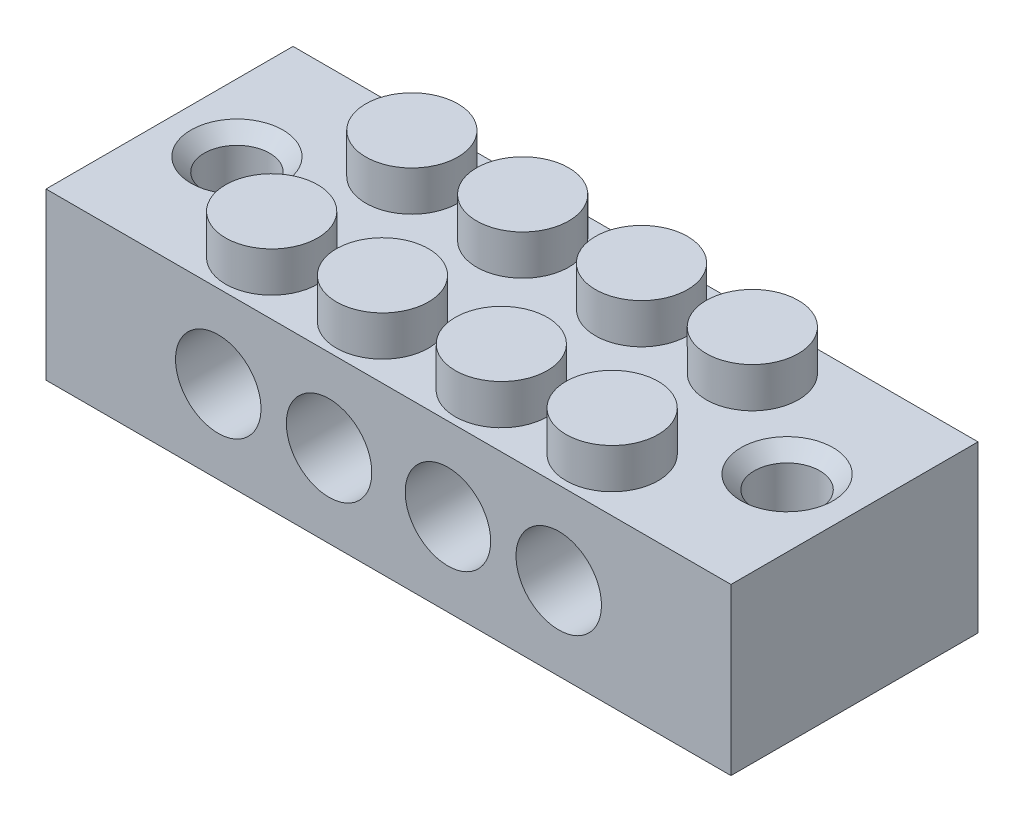
ISO-10303-21;
HEADER;
FILE_DESCRIPTION(('STEP AP214'),'2;1');
FILE_NAME('part.step','',(''),(''),'','','');
FILE_SCHEMA(('AUTOMOTIVE_DESIGN { 1 0 10303 214 1 1 1 1 }'));
ENDSEC;
DATA;
#1=APPLICATION_CONTEXT('core data for automotive mechanical design processes');
#2=APPLICATION_PROTOCOL_DEFINITION('international standard','automotive_design',2000,#1);
#3=PRODUCT_CONTEXT('',#1,'mechanical');
#4=PRODUCT('Part','Part','',(#3));
#5=PRODUCT_RELATED_PRODUCT_CATEGORY('part','',(#4));
#6=PRODUCT_DEFINITION_FORMATION('','',#4);
#7=PRODUCT_DEFINITION_CONTEXT('part definition',#1,'design');
#8=PRODUCT_DEFINITION('design','',#6,#7);
#9=PRODUCT_DEFINITION_SHAPE('','',#8);
#10=(LENGTH_UNIT() NAMED_UNIT(*) SI_UNIT(.MILLI.,.METRE.));
#11=(NAMED_UNIT(*) PLANE_ANGLE_UNIT() SI_UNIT($,.RADIAN.));
#12=(NAMED_UNIT(*) SI_UNIT($,.STERADIAN.) SOLID_ANGLE_UNIT());
#13=UNCERTAINTY_MEASURE_WITH_UNIT(LENGTH_MEASURE(1.E-05),#10,'distance_accuracy_value','');
#14=(GEOMETRIC_REPRESENTATION_CONTEXT(3) GLOBAL_UNCERTAINTY_ASSIGNED_CONTEXT((#13)) GLOBAL_UNIT_ASSIGNED_CONTEXT((#10,
#11,#12)) REPRESENTATION_CONTEXT('',''));
#15=CARTESIAN_POINT('',(0.,0.,0.));
#16=DIRECTION('',(0.,0.,1.));
#17=DIRECTION('',(1.,0.,0.));
#18=AXIS2_PLACEMENT_3D('',#15,#16,#17);
#19=CARTESIAN_POINT('',(-25.65,12.4,9.25000000000001));
#20=DIRECTION('',(1.,0.,0.));
#21=DIRECTION('',(0.,0.,-1.));
#22=AXIS2_PLACEMENT_3D('',#19,#20,#21);
#23=PLANE('',#22);
#24=DIRECTION('',(0.,0.,1.));
#25=VECTOR('',#24,1.);
#26=CARTESIAN_POINT('',(-25.65,0.,9.25000000000001));
#27=LINE('',#26,#25);
#28=CARTESIAN_POINT('',(-25.65,0.,-9.24999999999999));
#29=VERTEX_POINT('',#28);
#30=CARTESIAN_POINT('',(-25.65,0.,9.25000000000001));
#31=VERTEX_POINT('',#30);
#32=EDGE_CURVE('E101',#29,#31,#27,.T.);
#33=ORIENTED_EDGE('',*,*,#32,.T.);
#34=DIRECTION('',(0.,-1.,0.));
#35=VECTOR('',#34,1.);
#36=CARTESIAN_POINT('',(-25.65,12.4,9.25000000000001));
#37=LINE('',#36,#35);
#38=CARTESIAN_POINT('',(-25.65,12.4,9.25000000000001));
#39=VERTEX_POINT('',#38);
#40=EDGE_CURVE('E92',#39,#31,#37,.T.);
#41=ORIENTED_EDGE('',*,*,#40,.F.);
#42=DIRECTION('',(0.,0.,1.));
#43=VECTOR('',#42,1.);
#44=CARTESIAN_POINT('',(-25.65,12.4,9.25000000000001));
#45=LINE('',#44,#43);
#46=CARTESIAN_POINT('',(-25.65,12.4,-9.24999999999999));
#47=VERTEX_POINT('',#46);
#48=EDGE_CURVE('E86',#47,#39,#45,.T.);
#49=ORIENTED_EDGE('',*,*,#48,.F.);
#50=DIRECTION('',(0.,-1.,0.));
#51=VECTOR('',#50,1.);
#52=CARTESIAN_POINT('',(-25.65,12.4,-9.24999999999999));
#53=LINE('',#52,#51);
#54=EDGE_CURVE('E97',#47,#29,#53,.T.);
#55=ORIENTED_EDGE('',*,*,#54,.T.);
#56=EDGE_LOOP('',(#33,#41,#49,#55));
#57=FACE_BOUND('',#56,.T.);
#58=ADVANCED_FACE('F33',(#57),#23,.F.);
#59=CARTESIAN_POINT('',(25.65,12.4,9.25));
#60=DIRECTION('',(0.,0.,-1.));
#61=DIRECTION('',(-1.,0.,0.));
#62=AXIS2_PLACEMENT_3D('',#59,#60,#61);
#63=PLANE('',#62);
#64=CARTESIAN_POINT('',(-4.45,6.2,9.25));
#65=DIRECTION('',(0.,0.,-1.));
#66=DIRECTION('',(-1.,0.,0.));
#67=AXIS2_PLACEMENT_3D('',#64,#65,#66);
#68=CIRCLE('',#67,3.2);
#69=CARTESIAN_POINT('',(-7.65,6.2,9.25));
#70=VERTEX_POINT('',#69);
#71=EDGE_CURVE('E314',#70,#70,#68,.T.);
#72=ORIENTED_EDGE('',*,*,#71,.T.);
#73=EDGE_LOOP('',(#72));
#74=FACE_BOUND('',#73,.T.);
#75=CARTESIAN_POINT('',(-12.75,6.2,9.25));
#76=DIRECTION('',(0.,0.,-1.));
#77=DIRECTION('',(-1.,0.,0.));
#78=AXIS2_PLACEMENT_3D('',#75,#76,#77);
#79=CIRCLE('',#78,3.2);
#80=CARTESIAN_POINT('',(-15.95,6.2,9.25));
#81=VERTEX_POINT('',#80);
#82=EDGE_CURVE('E309',#81,#81,#79,.T.);
#83=ORIENTED_EDGE('',*,*,#82,.T.);
#84=EDGE_LOOP('',(#83));
#85=FACE_BOUND('',#84,.T.);
#86=CARTESIAN_POINT('',(4.45,6.2,9.25));
#87=DIRECTION('',(0.,0.,1.));
#88=DIRECTION('',(1.,0.,0.));
#89=AXIS2_PLACEMENT_3D('',#86,#87,#88);
#90=CIRCLE('',#89,3.2);
#91=CARTESIAN_POINT('',(7.65,6.2,9.25));
#92=VERTEX_POINT('',#91);
#93=EDGE_CURVE('E327',#92,#92,#90,.T.);
#94=ORIENTED_EDGE('',*,*,#93,.F.);
#95=EDGE_LOOP('',(#94));
#96=FACE_BOUND('',#95,.T.);
#97=CARTESIAN_POINT('',(12.75,6.2,9.25));
#98=DIRECTION('',(0.,0.,1.));
#99=DIRECTION('',(1.,0.,0.));
#100=AXIS2_PLACEMENT_3D('',#97,#98,#99);
#101=CIRCLE('',#100,3.2);
#102=CARTESIAN_POINT('',(15.95,6.2,9.25));
#103=VERTEX_POINT('',#102);
#104=EDGE_CURVE('E324',#103,#103,#101,.T.);
#105=ORIENTED_EDGE('',*,*,#104,.F.);
#106=EDGE_LOOP('',(#105));
#107=FACE_BOUND('',#106,.T.);
#108=DIRECTION('',(1.,0.,0.));
#109=VECTOR('',#108,1.);
#110=CARTESIAN_POINT('',(25.65,0.,9.25));
#111=LINE('',#110,#109);
#112=CARTESIAN_POINT('',(25.65,0.,9.25));
#113=VERTEX_POINT('',#112);
#114=EDGE_CURVE('E91',#31,#113,#111,.T.);
#115=ORIENTED_EDGE('',*,*,#114,.T.);
#116=DIRECTION('',(0.,-1.,0.));
#117=VECTOR('',#116,1.);
#118=CARTESIAN_POINT('',(25.65,12.4,9.25));
#119=LINE('',#118,#117);
#120=CARTESIAN_POINT('',(25.65,12.4,9.25));
#121=VERTEX_POINT('',#120);
#122=EDGE_CURVE('E89',#121,#113,#119,.T.);
#123=ORIENTED_EDGE('',*,*,#122,.F.);
#124=DIRECTION('',(1.,0.,0.));
#125=VECTOR('',#124,1.);
#126=CARTESIAN_POINT('',(25.65,12.4,9.25));
#127=LINE('',#126,#125);
#128=EDGE_CURVE('E81',#39,#121,#127,.T.);
#129=ORIENTED_EDGE('',*,*,#128,.F.);
#130=ORIENTED_EDGE('',*,*,#40,.T.);
#131=EDGE_LOOP('',(#115,#123,#129,#130));
#132=FACE_BOUND('',#131,.T.);
#133=ADVANCED_FACE('F90',(#74,#85,#96,#107,#132),#63,.F.);
#134=CARTESIAN_POINT('',(25.65,12.4,9.25));
#135=DIRECTION('',(-1.,0.,0.));
#136=DIRECTION('',(0.,0.,1.));
#137=AXIS2_PLACEMENT_3D('',#134,#135,#136);
#138=PLANE('',#137);
#139=DIRECTION('',(0.,0.,-1.));
#140=VECTOR('',#139,1.);
#141=CARTESIAN_POINT('',(25.65,0.,9.25));
#142=LINE('',#141,#140);
#143=CARTESIAN_POINT('',(25.65,0.,-9.25));
#144=VERTEX_POINT('',#143);
#145=EDGE_CURVE('E67',#113,#144,#142,.T.);
#146=ORIENTED_EDGE('',*,*,#145,.T.);
#147=DIRECTION('',(0.,-1.,0.));
#148=VECTOR('',#147,1.);
#149=CARTESIAN_POINT('',(25.65,12.4,-9.25));
#150=LINE('',#149,#148);
#151=CARTESIAN_POINT('',(25.65,12.4,-9.25));
#152=VERTEX_POINT('',#151);
#153=EDGE_CURVE('E93',#152,#144,#150,.T.);
#154=ORIENTED_EDGE('',*,*,#153,.F.);
#155=DIRECTION('',(0.,0.,-1.));
#156=VECTOR('',#155,1.);
#157=CARTESIAN_POINT('',(25.65,12.4,9.25));
#158=LINE('',#157,#156);
#159=EDGE_CURVE('E84',#121,#152,#158,.T.);
#160=ORIENTED_EDGE('',*,*,#159,.F.);
#161=ORIENTED_EDGE('',*,*,#122,.T.);
#162=EDGE_LOOP('',(#146,#154,#160,#161));
#163=FACE_BOUND('',#162,.T.);
#164=ADVANCED_FACE('F95',(#163),#138,.F.);
#165=CARTESIAN_POINT('',(25.65,12.4,-9.25));
#166=DIRECTION('',(0.,0.,1.));
#167=DIRECTION('',(1.,0.,0.));
#168=AXIS2_PLACEMENT_3D('',#165,#166,#167);
#169=PLANE('',#168);
#170=CARTESIAN_POINT('',(-4.45,6.2,-9.25));
#171=DIRECTION('',(0.,0.,-1.));
#172=DIRECTION('',(-1.,0.,0.));
#173=AXIS2_PLACEMENT_3D('',#170,#171,#172);
#174=CIRCLE('',#173,3.2);
#175=CARTESIAN_POINT('',(-7.65,6.2,-9.25));
#176=VERTEX_POINT('',#175);
#177=EDGE_CURVE('E310',#176,#176,#174,.T.);
#178=ORIENTED_EDGE('',*,*,#177,.F.);
#179=EDGE_LOOP('',(#178));
#180=FACE_BOUND('',#179,.T.);
#181=CARTESIAN_POINT('',(-12.75,6.2,-9.25));
#182=DIRECTION('',(0.,0.,-1.));
#183=DIRECTION('',(-1.,0.,0.));
#184=AXIS2_PLACEMENT_3D('',#181,#182,#183);
#185=CIRCLE('',#184,3.2);
#186=CARTESIAN_POINT('',(-15.95,6.2,-9.25));
#187=VERTEX_POINT('',#186);
#188=EDGE_CURVE('E317',#187,#187,#185,.T.);
#189=ORIENTED_EDGE('',*,*,#188,.F.);
#190=EDGE_LOOP('',(#189));
#191=FACE_BOUND('',#190,.T.);
#192=CARTESIAN_POINT('',(4.45,6.2,-9.25));
#193=DIRECTION('',(0.,0.,1.));
#194=DIRECTION('',(1.,0.,0.));
#195=AXIS2_PLACEMENT_3D('',#192,#193,#194);
#196=CIRCLE('',#195,3.2);
#197=CARTESIAN_POINT('',(7.65,6.2,-9.25));
#198=VERTEX_POINT('',#197);
#199=EDGE_CURVE('E104',#198,#198,#196,.T.);
#200=ORIENTED_EDGE('',*,*,#199,.T.);
#201=EDGE_LOOP('',(#200));
#202=FACE_BOUND('',#201,.T.);
#203=CARTESIAN_POINT('',(12.75,6.2,-9.25));
#204=DIRECTION('',(0.,0.,1.));
#205=DIRECTION('',(1.,0.,0.));
#206=AXIS2_PLACEMENT_3D('',#203,#204,#205);
#207=CIRCLE('',#206,3.2);
#208=CARTESIAN_POINT('',(15.95,6.2,-9.25));
#209=VERTEX_POINT('',#208);
#210=EDGE_CURVE('E330',#209,#209,#207,.T.);
#211=ORIENTED_EDGE('',*,*,#210,.T.);
#212=EDGE_LOOP('',(#211));
#213=FACE_BOUND('',#212,.T.);
#214=DIRECTION('',(-1.,0.,0.));
#215=VECTOR('',#214,1.);
#216=CARTESIAN_POINT('',(25.65,0.,-9.25));
#217=LINE('',#216,#215);
#218=EDGE_CURVE('E73',#144,#29,#217,.T.);
#219=ORIENTED_EDGE('',*,*,#218,.T.);
#220=ORIENTED_EDGE('',*,*,#54,.F.);
#221=DIRECTION('',(-1.,0.,0.));
#222=VECTOR('',#221,1.);
#223=CARTESIAN_POINT('',(25.65,12.4,-9.25));
#224=LINE('',#223,#222);
#225=EDGE_CURVE('E50',#152,#47,#224,.T.);
#226=ORIENTED_EDGE('',*,*,#225,.F.);
#227=ORIENTED_EDGE('',*,*,#153,.T.);
#228=EDGE_LOOP('',(#219,#220,#226,#227));
#229=FACE_BOUND('',#228,.T.);
#230=ADVANCED_FACE('F136',(#180,#191,#202,#213,#229),#169,.F.);
#231=CARTESIAN_POINT('',(0.,12.4,0.));
#232=DIRECTION('',(0.,1.,0.));
#233=DIRECTION('',(0.,0.,1.));
#234=AXIS2_PLACEMENT_3D('',#231,#232,#233);
#235=PLANE('',#234);
#236=CARTESIAN_POINT('',(-12.75,12.4,5.25));
#237=DIRECTION('',(0.,1.,0.));
#238=DIRECTION('',(0.,0.,1.));
#239=AXIS2_PLACEMENT_3D('',#236,#237,#238);
#240=CIRCLE('',#239,3.45);
#241=CARTESIAN_POINT('',(-12.75,12.4,8.7));
#242=VERTEX_POINT('',#241);
#243=EDGE_CURVE('E11',#242,#242,#240,.T.);
#244=ORIENTED_EDGE('',*,*,#243,.F.);
#245=EDGE_LOOP('',(#244));
#246=FACE_BOUND('',#245,.T.);
#247=CARTESIAN_POINT('',(-4.45,12.4,5.25));
#248=DIRECTION('',(0.,1.,0.));
#249=DIRECTION('',(0.,0.,1.));
#250=AXIS2_PLACEMENT_3D('',#247,#248,#249);
#251=CIRCLE('',#250,3.45);
#252=CARTESIAN_POINT('',(-4.45,12.4,8.7));
#253=VERTEX_POINT('',#252);
#254=EDGE_CURVE('E42',#253,#253,#251,.T.);
#255=ORIENTED_EDGE('',*,*,#254,.F.);
#256=EDGE_LOOP('',(#255));
#257=FACE_BOUND('',#256,.T.);
#258=CARTESIAN_POINT('',(-12.75,12.4,-5.25));
#259=DIRECTION('',(0.,1.,0.));
#260=DIRECTION('',(0.,0.,-1.));
#261=AXIS2_PLACEMENT_3D('',#258,#259,#260);
#262=CIRCLE('',#261,3.45);
#263=CARTESIAN_POINT('',(-12.75,12.4,-8.7));
#264=VERTEX_POINT('',#263);
#265=EDGE_CURVE('E142',#264,#264,#262,.T.);
#266=ORIENTED_EDGE('',*,*,#265,.F.);
#267=EDGE_LOOP('',(#266));
#268=FACE_BOUND('',#267,.T.);
#269=CARTESIAN_POINT('',(-4.45,12.4,-5.25));
#270=DIRECTION('',(0.,1.,0.));
#271=DIRECTION('',(0.,0.,-1.));
#272=AXIS2_PLACEMENT_3D('',#269,#270,#271);
#273=CIRCLE('',#272,3.45);
#274=CARTESIAN_POINT('',(-4.45,12.4,-8.7));
#275=VERTEX_POINT('',#274);
#276=EDGE_CURVE('E146',#275,#275,#273,.T.);
#277=ORIENTED_EDGE('',*,*,#276,.F.);
#278=EDGE_LOOP('',(#277));
#279=FACE_BOUND('',#278,.T.);
#280=CARTESIAN_POINT('',(12.75,12.4,-5.25));
#281=DIRECTION('',(0.,1.,0.));
#282=DIRECTION('',(0.,0.,1.));
#283=AXIS2_PLACEMENT_3D('',#280,#281,#282);
#284=CIRCLE('',#283,3.45);
#285=CARTESIAN_POINT('',(12.75,12.4,-1.8));
#286=VERTEX_POINT('',#285);
#287=EDGE_CURVE('E126',#286,#286,#284,.T.);
#288=ORIENTED_EDGE('',*,*,#287,.F.);
#289=EDGE_LOOP('',(#288));
#290=FACE_BOUND('',#289,.T.);
#291=CARTESIAN_POINT('',(4.45,12.4,-5.25));
#292=DIRECTION('',(0.,1.,0.));
#293=DIRECTION('',(0.,0.,1.));
#294=AXIS2_PLACEMENT_3D('',#291,#292,#293);
#295=CIRCLE('',#294,3.45);
#296=CARTESIAN_POINT('',(4.45,12.4,-1.8));
#297=VERTEX_POINT('',#296);
#298=EDGE_CURVE('E123',#297,#297,#295,.T.);
#299=ORIENTED_EDGE('',*,*,#298,.F.);
#300=EDGE_LOOP('',(#299));
#301=FACE_BOUND('',#300,.T.);
#302=CARTESIAN_POINT('',(12.75,12.4,5.25));
#303=DIRECTION('',(0.,1.,0.));
#304=DIRECTION('',(0.,0.,1.));
#305=AXIS2_PLACEMENT_3D('',#302,#303,#304);
#306=CIRCLE('',#305,3.45);
#307=CARTESIAN_POINT('',(12.75,12.4,8.7));
#308=VERTEX_POINT('',#307);
#309=EDGE_CURVE('E154',#308,#308,#306,.T.);
#310=ORIENTED_EDGE('',*,*,#309,.F.);
#311=EDGE_LOOP('',(#310));
#312=FACE_BOUND('',#311,.T.);
#313=CARTESIAN_POINT('',(4.45,12.4,5.25));
#314=DIRECTION('',(0.,1.,0.));
#315=DIRECTION('',(0.,0.,1.));
#316=AXIS2_PLACEMENT_3D('',#313,#314,#315);
#317=CIRCLE('',#316,3.45);
#318=CARTESIAN_POINT('',(4.45,12.4,8.7));
#319=VERTEX_POINT('',#318);
#320=EDGE_CURVE('E158',#319,#319,#317,.T.);
#321=ORIENTED_EDGE('',*,*,#320,.F.);
#322=EDGE_LOOP('',(#321));
#323=FACE_BOUND('',#322,.T.);
#324=CARTESIAN_POINT('',(20.6,12.4,0.));
#325=DIRECTION('',(0.,1.,0.));
#326=DIRECTION('',(0.,0.,1.));
#327=AXIS2_PLACEMENT_3D('',#324,#325,#326);
#328=CIRCLE('',#327,3.45000000000004);
#329=CARTESIAN_POINT('',(20.6,12.4,3.45000000000004));
#330=VERTEX_POINT('',#329);
#331=EDGE_CURVE('E117',#330,#330,#328,.F.);
#332=ORIENTED_EDGE('',*,*,#331,.T.);
#333=EDGE_LOOP('',(#332));
#334=FACE_BOUND('',#333,.T.);
#335=CARTESIAN_POINT('',(-20.6,12.4,0.));
#336=DIRECTION('',(0.,1.,0.));
#337=DIRECTION('',(0.,0.,1.));
#338=AXIS2_PLACEMENT_3D('',#335,#336,#337);
#339=CIRCLE('',#338,3.44999999999998);
#340=CARTESIAN_POINT('',(-20.6,12.4,3.44999999999998));
#341=VERTEX_POINT('',#340);
#342=EDGE_CURVE('E114',#341,#341,#339,.F.);
#343=ORIENTED_EDGE('',*,*,#342,.T.);
#344=EDGE_LOOP('',(#343));
#345=FACE_BOUND('',#344,.T.);
#346=ORIENTED_EDGE('',*,*,#48,.T.);
#347=ORIENTED_EDGE('',*,*,#128,.T.);
#348=ORIENTED_EDGE('',*,*,#159,.T.);
#349=ORIENTED_EDGE('',*,*,#225,.T.);
#350=EDGE_LOOP('',(#346,#347,#348,#349));
#351=FACE_BOUND('',#350,.T.);
#352=ADVANCED_FACE('F82',(#246,#257,#268,#279,#290,#301,#312,#323,#334,#345,#351),#235,.T.);
#353=CARTESIAN_POINT('',(0.,0.,0.));
#354=DIRECTION('',(0.,1.,0.));
#355=DIRECTION('',(0.,0.,1.));
#356=AXIS2_PLACEMENT_3D('',#353,#354,#355);
#357=PLANE('',#356);
#358=CARTESIAN_POINT('',(-20.6,0.,0.));
#359=DIRECTION('',(0.,-1.,0.));
#360=DIRECTION('',(0.,0.,1.));
#361=AXIS2_PLACEMENT_3D('',#358,#359,#360);
#362=CIRCLE('',#361,2.45);
#363=CARTESIAN_POINT('',(-20.6,0.,2.45));
#364=VERTEX_POINT('',#363);
#365=EDGE_CURVE('E305',#364,#364,#362,.T.);
#366=ORIENTED_EDGE('',*,*,#365,.F.);
#367=EDGE_LOOP('',(#366));
#368=FACE_BOUND('',#367,.T.);
#369=CARTESIAN_POINT('',(20.6,0.,0.));
#370=DIRECTION('',(0.,1.,0.));
#371=DIRECTION('',(0.,0.,1.));
#372=AXIS2_PLACEMENT_3D('',#369,#370,#371);
#373=CIRCLE('',#372,2.45);
#374=CARTESIAN_POINT('',(20.6,0.,2.45));
#375=VERTEX_POINT('',#374);
#376=EDGE_CURVE('E313',#375,#375,#373,.T.);
#377=ORIENTED_EDGE('',*,*,#376,.T.);
#378=EDGE_LOOP('',(#377));
#379=FACE_BOUND('',#378,.T.);
#380=ORIENTED_EDGE('',*,*,#32,.F.);
#381=ORIENTED_EDGE('',*,*,#218,.F.);
#382=ORIENTED_EDGE('',*,*,#145,.F.);
#383=ORIENTED_EDGE('',*,*,#114,.F.);
#384=EDGE_LOOP('',(#380,#381,#382,#383));
#385=FACE_BOUND('',#384,.T.);
#386=ADVANCED_FACE('F135',(#368,#379,#385),#357,.F.);
#387=CARTESIAN_POINT('',(12.75,6.2,-9.25));
#388=DIRECTION('',(0.,0.,1.));
#389=DIRECTION('',(1.,0.,0.));
#390=AXIS2_PLACEMENT_3D('',#387,#388,#389);
#391=CYLINDRICAL_SURFACE('',#390,3.2);
#392=ORIENTED_EDGE('',*,*,#210,.F.);
#393=EDGE_LOOP('',(#392));
#394=FACE_BOUND('',#393,.T.);
#395=ORIENTED_EDGE('',*,*,#104,.T.);
#396=EDGE_LOOP('',(#395));
#397=FACE_BOUND('',#396,.T.);
#398=ADVANCED_FACE('F192',(#394,#397),#391,.F.);
#399=CARTESIAN_POINT('',(4.45,6.2,-9.25));
#400=DIRECTION('',(0.,0.,1.));
#401=DIRECTION('',(1.,0.,0.));
#402=AXIS2_PLACEMENT_3D('',#399,#400,#401);
#403=CYLINDRICAL_SURFACE('',#402,3.2);
#404=ORIENTED_EDGE('',*,*,#199,.F.);
#405=EDGE_LOOP('',(#404));
#406=FACE_BOUND('',#405,.T.);
#407=ORIENTED_EDGE('',*,*,#93,.T.);
#408=EDGE_LOOP('',(#407));
#409=FACE_BOUND('',#408,.T.);
#410=ADVANCED_FACE('F197',(#406,#409),#403,.F.);
#411=CARTESIAN_POINT('',(20.6,0.,0.));
#412=DIRECTION('',(0.,1.,0.));
#413=DIRECTION('',(0.,0.,1.));
#414=AXIS2_PLACEMENT_3D('',#411,#412,#413);
#415=CYLINDRICAL_SURFACE('',#414,2.45);
#416=CARTESIAN_POINT('',(20.6,11.4,0.));
#417=DIRECTION('',(0.,1.,0.));
#418=DIRECTION('',(0.,0.,1.));
#419=AXIS2_PLACEMENT_3D('',#416,#417,#418);
#420=CIRCLE('',#419,2.45);
#421=CARTESIAN_POINT('',(20.6,11.4,2.45));
#422=VERTEX_POINT('',#421);
#423=EDGE_CURVE('E111',#422,#422,#420,.T.);
#424=CARTESIAN_POINT('',(20.6,11.4,2.45));
#425=CARTESIAN_POINT('',(20.6,11.28125,2.45));
#426=CARTESIAN_POINT('',(20.6,11.1625,2.45));
#427=CARTESIAN_POINT('',(20.6,10.925,2.45));
#428=CARTESIAN_POINT('',(20.6,10.80625,2.45));
#429=CARTESIAN_POINT('',(20.6,10.56875,2.45));
#430=CARTESIAN_POINT('',(20.6,10.45,2.45));
#431=CARTESIAN_POINT('',(20.6,10.2125,2.45));
#432=CARTESIAN_POINT('',(20.6,10.09375,2.45));
#433=CARTESIAN_POINT('',(20.6,9.85624999999997,2.45));
#434=CARTESIAN_POINT('',(20.6,9.73749999999998,2.45));
#435=CARTESIAN_POINT('',(20.6,9.49999999999998,2.45));
#436=CARTESIAN_POINT('',(20.6,9.38124999999997,2.45));
#437=CARTESIAN_POINT('',(20.6,9.14374999999998,2.45));
#438=CARTESIAN_POINT('',(20.6,9.02499999999998,2.45));
#439=CARTESIAN_POINT('',(20.6,8.78749999999998,2.45));
#440=CARTESIAN_POINT('',(20.6,8.66874999999998,2.45));
#441=CARTESIAN_POINT('',(20.6,8.43124999999998,2.45));
#442=CARTESIAN_POINT('',(20.6,8.31249999999998,2.45));
#443=CARTESIAN_POINT('',(20.6,8.07499999999998,2.45));
#444=CARTESIAN_POINT('',(20.6,7.95624999999998,2.45));
#445=CARTESIAN_POINT('',(20.6,7.71874999999998,2.45));
#446=CARTESIAN_POINT('',(20.6,7.59999999999998,2.45));
#447=CARTESIAN_POINT('',(20.6,7.36249999999998,2.45));
#448=CARTESIAN_POINT('',(20.6,7.24374999999998,2.45));
#449=CARTESIAN_POINT('',(20.6,7.00624999999998,2.45));
#450=CARTESIAN_POINT('',(20.6,6.88749999999998,2.45));
#451=CARTESIAN_POINT('',(20.6,6.64999999999998,2.45));
#452=CARTESIAN_POINT('',(20.6,6.53124999999998,2.45));
#453=CARTESIAN_POINT('',(20.6,6.29374999999998,2.45));
#454=CARTESIAN_POINT('',(20.6,6.17499999999998,2.45));
#455=CARTESIAN_POINT('',(20.6,5.93749999999998,2.45));
#456=CARTESIAN_POINT('',(20.6,5.81874999999999,2.45));
#457=CARTESIAN_POINT('',(20.6,5.58124999999999,2.45));
#458=CARTESIAN_POINT('',(20.6,5.46249999999999,2.45));
#459=CARTESIAN_POINT('',(20.6,5.22499999999999,2.45));
#460=CARTESIAN_POINT('',(20.6,5.10624999999999,2.45));
#461=CARTESIAN_POINT('',(20.6,4.86874999999999,2.45));
#462=CARTESIAN_POINT('',(20.6,4.74999999999999,2.45));
#463=CARTESIAN_POINT('',(20.6,4.51249999999999,2.45));
#464=CARTESIAN_POINT('',(20.6,4.39374999999999,2.45));
#465=CARTESIAN_POINT('',(20.6,4.15624999999999,2.45));
#466=CARTESIAN_POINT('',(20.6,4.03749999999999,2.45));
#467=CARTESIAN_POINT('',(20.6,3.79999999999999,2.45));
#468=CARTESIAN_POINT('',(20.6,3.68124999999999,2.45));
#469=CARTESIAN_POINT('',(20.6,3.44374999999999,2.45));
#470=CARTESIAN_POINT('',(20.6,3.32499999999999,2.45));
#471=CARTESIAN_POINT('',(20.6,3.08749999999999,2.45));
#472=CARTESIAN_POINT('',(20.6,2.96874999999999,2.45));
#473=CARTESIAN_POINT('',(20.6,2.73124999999999,2.45));
#474=CARTESIAN_POINT('',(20.6,2.61249999999999,2.45));
#475=CARTESIAN_POINT('',(20.6,2.37499999999999,2.45));
#476=CARTESIAN_POINT('',(20.6,2.25624999999999,2.45));
#477=CARTESIAN_POINT('',(20.6,2.01875,2.45));
#478=CARTESIAN_POINT('',(20.6,1.9,2.45));
#479=CARTESIAN_POINT('',(20.6,1.6625,2.45));
#480=CARTESIAN_POINT('',(20.6,1.54375,2.45));
#481=CARTESIAN_POINT('',(20.6,1.30625,2.45));
#482=CARTESIAN_POINT('',(20.6,1.1875,2.45));
#483=CARTESIAN_POINT('',(20.6,0.949999999999997,2.45));
#484=CARTESIAN_POINT('',(20.6,0.831249999999997,2.45));
#485=CARTESIAN_POINT('',(20.6,0.593749999999998,2.45));
#486=CARTESIAN_POINT('',(20.6,0.474999999999998,2.45));
#487=CARTESIAN_POINT('',(20.6,0.237499999999999,2.45));
#488=CARTESIAN_POINT('',(20.6,0.11875,2.45));
#489=CARTESIAN_POINT('',(20.6,0.,2.45));
#490=B_SPLINE_CURVE_WITH_KNOTS('',3,(#424,#425,#426,#427,#428,#429,#430,#431,#432,#433,#434,
#435,#436,#437,#438,#439,#440,#441,#442,#443,#444,#445,#446,#447,#448,#449,#450,#451,#452,#453,
#454,#455,#456,#457,#458,#459,#460,#461,#462,#463,#464,#465,#466,#467,#468,#469,#470,#471,#472,
#473,#474,#475,#476,#477,#478,#479,#480,#481,#482,#483,#484,#485,#486,#487,#488,#489),
.UNSPECIFIED.,.F.,.F.,(4,2,2,2,2,2,2,2,2,2,2,2,2,2,2,2,2,2,2,2,2,2,2,2,2,2,2,2,2,2,2,2,4),(0.,
0.356249999999999,0.712499999999998,1.06875,1.425,1.78125,2.1375,2.49374999999999,
2.84999999999999,3.20624999999999,3.56249999999999,3.91874999999999,4.27499999999999,
4.63124999999999,4.98749999999999,5.34374999999999,5.69999999999999,6.05624999999998,
6.41249999999998,6.76874999999998,7.12499999999998,7.48124999999998,7.83749999999998,
8.19374999999998,8.54999999999998,8.90624999999998,9.26249999999998,9.61874999999997,
9.97499999999997,10.33125,10.6875,11.04375,11.4),.UNSPECIFIED.);
#491=EDGE_CURVE('BSEAM201',#422,#375,#490,.T.);
#492=ORIENTED_EDGE('',*,*,#423,.T.);
#493=ORIENTED_EDGE('',*,*,#376,.F.);
#494=ORIENTED_EDGE('',*,*,#491,.T.);
#495=ORIENTED_EDGE('',*,*,#491,.F.);
#496=EDGE_LOOP('',(#492,#494,#493,#495));
#497=FACE_BOUND('',#496,.T.);
#498=ADVANCED_FACE('F201',(#497),#415,.F.);
#499=CARTESIAN_POINT('',(-12.75,6.2,-9.25));
#500=DIRECTION('',(0.,0.,1.));
#501=DIRECTION('',(1.,0.,0.));
#502=AXIS2_PLACEMENT_3D('',#499,#500,#501);
#503=CYLINDRICAL_SURFACE('',#502,3.2);
#504=ORIENTED_EDGE('',*,*,#188,.T.);
#505=EDGE_LOOP('',(#504));
#506=FACE_BOUND('',#505,.T.);
#507=ORIENTED_EDGE('',*,*,#82,.F.);
#508=EDGE_LOOP('',(#507));
#509=FACE_BOUND('',#508,.T.);
#510=ADVANCED_FACE('F205',(#506,#509),#503,.F.);
#511=CARTESIAN_POINT('',(-4.45,6.2,-9.25));
#512=DIRECTION('',(0.,0.,1.));
#513=DIRECTION('',(1.,0.,0.));
#514=AXIS2_PLACEMENT_3D('',#511,#512,#513);
#515=CYLINDRICAL_SURFACE('',#514,3.2);
#516=ORIENTED_EDGE('',*,*,#177,.T.);
#517=EDGE_LOOP('',(#516));
#518=FACE_BOUND('',#517,.T.);
#519=ORIENTED_EDGE('',*,*,#71,.F.);
#520=EDGE_LOOP('',(#519));
#521=FACE_BOUND('',#520,.T.);
#522=ADVANCED_FACE('F209',(#518,#521),#515,.F.);
#523=CARTESIAN_POINT('',(-20.6,0.,0.));
#524=DIRECTION('',(0.,1.,0.));
#525=DIRECTION('',(0.,0.,1.));
#526=AXIS2_PLACEMENT_3D('',#523,#524,#525);
#527=CYLINDRICAL_SURFACE('',#526,2.45);
#528=CARTESIAN_POINT('',(-20.6,11.4,0.));
#529=DIRECTION('',(0.,1.,0.));
#530=DIRECTION('',(0.,0.,1.));
#531=AXIS2_PLACEMENT_3D('',#528,#529,#530);
#532=CIRCLE('',#531,2.45);
#533=CARTESIAN_POINT('',(-20.6,11.4,2.45));
#534=VERTEX_POINT('',#533);
#535=EDGE_CURVE('E120',#534,#534,#532,.T.);
#536=CARTESIAN_POINT('',(-20.6,11.4,2.45));
#537=CARTESIAN_POINT('',(-20.6,11.28125,2.45));
#538=CARTESIAN_POINT('',(-20.6,11.1625,2.45));
#539=CARTESIAN_POINT('',(-20.6,10.925,2.45));
#540=CARTESIAN_POINT('',(-20.6,10.80625,2.45));
#541=CARTESIAN_POINT('',(-20.6,10.56875,2.45));
#542=CARTESIAN_POINT('',(-20.6,10.45,2.45));
#543=CARTESIAN_POINT('',(-20.6,10.2125,2.45));
#544=CARTESIAN_POINT('',(-20.6,10.09375,2.45));
#545=CARTESIAN_POINT('',(-20.6,9.85625000000001,2.45));
#546=CARTESIAN_POINT('',(-20.6,9.73750000000001,2.45));
#547=CARTESIAN_POINT('',(-20.6,9.50000000000001,2.45));
#548=CARTESIAN_POINT('',(-20.6,9.38125000000001,2.45));
#549=CARTESIAN_POINT('',(-20.6,9.14375000000001,2.45));
#550=CARTESIAN_POINT('',(-20.6,9.02500000000001,2.45));
#551=CARTESIAN_POINT('',(-20.6,8.78750000000001,2.45));
#552=CARTESIAN_POINT('',(-20.6,8.66875000000001,2.45));
#553=CARTESIAN_POINT('',(-20.6,8.43125000000001,2.45));
#554=CARTESIAN_POINT('',(-20.6,8.31250000000001,2.45));
#555=CARTESIAN_POINT('',(-20.6,8.07500000000001,2.45));
#556=CARTESIAN_POINT('',(-20.6,7.95625000000001,2.45));
#557=CARTESIAN_POINT('',(-20.6,7.71875000000001,2.45));
#558=CARTESIAN_POINT('',(-20.6,7.60000000000001,2.45));
#559=CARTESIAN_POINT('',(-20.6,7.36250000000001,2.45));
#560=CARTESIAN_POINT('',(-20.6,7.24375000000001,2.45));
#561=CARTESIAN_POINT('',(-20.6,7.00625000000001,2.45));
#562=CARTESIAN_POINT('',(-20.6,6.88750000000001,2.45));
#563=CARTESIAN_POINT('',(-20.6,6.65000000000001,2.45));
#564=CARTESIAN_POINT('',(-20.6,6.53125000000001,2.45));
#565=CARTESIAN_POINT('',(-20.6,6.29375000000001,2.45));
#566=CARTESIAN_POINT('',(-20.6,6.17500000000001,2.45));
#567=CARTESIAN_POINT('',(-20.6,5.93750000000001,2.45));
#568=CARTESIAN_POINT('',(-20.6,5.81875000000001,2.45));
#569=CARTESIAN_POINT('',(-20.6,5.58125000000001,2.45));
#570=CARTESIAN_POINT('',(-20.6,5.46250000000001,2.45));
#571=CARTESIAN_POINT('',(-20.6,5.22500000000001,2.45));
#572=CARTESIAN_POINT('',(-20.6,5.10625,2.45));
#573=CARTESIAN_POINT('',(-20.6,4.86875,2.45));
#574=CARTESIAN_POINT('',(-20.6,4.75000000000001,2.45));
#575=CARTESIAN_POINT('',(-20.6,4.51250000000001,2.45));
#576=CARTESIAN_POINT('',(-20.6,4.39375,2.45));
#577=CARTESIAN_POINT('',(-20.6,4.15625,2.45));
#578=CARTESIAN_POINT('',(-20.6,4.0375,2.45));
#579=CARTESIAN_POINT('',(-20.6,3.8,2.45));
#580=CARTESIAN_POINT('',(-20.6,3.68125,2.45));
#581=CARTESIAN_POINT('',(-20.6,3.44375,2.45));
#582=CARTESIAN_POINT('',(-20.6,3.325,2.45));
#583=CARTESIAN_POINT('',(-20.6,3.0875,2.45));
#584=CARTESIAN_POINT('',(-20.6,2.96875,2.45));
#585=CARTESIAN_POINT('',(-20.6,2.73125,2.45));
#586=CARTESIAN_POINT('',(-20.6,2.6125,2.45));
#587=CARTESIAN_POINT('',(-20.6,2.375,2.45));
#588=CARTESIAN_POINT('',(-20.6,2.25625,2.45));
#589=CARTESIAN_POINT('',(-20.6,2.01875,2.45));
#590=CARTESIAN_POINT('',(-20.6,1.9,2.45));
#591=CARTESIAN_POINT('',(-20.6,1.6625,2.45));
#592=CARTESIAN_POINT('',(-20.6,1.54375,2.45));
#593=CARTESIAN_POINT('',(-20.6,1.30625,2.45));
#594=CARTESIAN_POINT('',(-20.6,1.1875,2.45));
#595=CARTESIAN_POINT('',(-20.6,0.950000000000002,2.45));
#596=CARTESIAN_POINT('',(-20.6,0.831250000000001,2.45));
#597=CARTESIAN_POINT('',(-20.6,0.593750000000001,2.45));
#598=CARTESIAN_POINT('',(-20.6,0.475000000000001,2.45));
#599=CARTESIAN_POINT('',(-20.6,0.2375,2.45));
#600=CARTESIAN_POINT('',(-20.6,0.11875,2.45));
#601=CARTESIAN_POINT('',(-20.6,0.,2.45));
#602=B_SPLINE_CURVE_WITH_KNOTS('',3,(#536,#537,#538,#539,#540,#541,#542,#543,#544,#545,#546,
#547,#548,#549,#550,#551,#552,#553,#554,#555,#556,#557,#558,#559,#560,#561,#562,#563,#564,#565,
#566,#567,#568,#569,#570,#571,#572,#573,#574,#575,#576,#577,#578,#579,#580,#581,#582,#583,#584,
#585,#586,#587,#588,#589,#590,#591,#592,#593,#594,#595,#596,#597,#598,#599,#600,#601),
.UNSPECIFIED.,.F.,.F.,(4,2,2,2,2,2,2,2,2,2,2,2,2,2,2,2,2,2,2,2,2,2,2,2,2,2,2,2,2,2,2,2,4),(0.,
0.356250000000001,0.712500000000001,1.06875,1.425,1.78125,2.1375,2.49375,2.85,3.20625,3.5625,
3.91875,4.275,4.63125,4.98750000000001,5.34375000000001,5.70000000000001,6.05625000000001,
6.41250000000001,6.76875000000001,7.12500000000001,7.48125000000001,7.83750000000001,
8.19375000000001,8.55000000000001,8.90625000000001,9.26250000000001,9.61875000000001,
9.97500000000001,10.33125,10.6875,11.04375,11.4),.UNSPECIFIED.);
#603=EDGE_CURVE('BSEAM174',#534,#364,#602,.T.);
#604=ORIENTED_EDGE('',*,*,#535,.T.);
#605=ORIENTED_EDGE('',*,*,#365,.T.);
#606=ORIENTED_EDGE('',*,*,#603,.T.);
#607=ORIENTED_EDGE('',*,*,#603,.F.);
#608=EDGE_LOOP('',(#604,#606,#605,#607));
#609=FACE_BOUND('',#608,.T.);
#610=ADVANCED_FACE('F174',(#609),#527,.F.);
#611=CARTESIAN_POINT('',(20.6,11.4,0.));
#612=DIRECTION('',(0.,1.,0.));
#613=DIRECTION('',(0.,0.,1.));
#614=AXIS2_PLACEMENT_3D('',#611,#612,#613);
#615=CONICAL_SURFACE('',#614,2.45,0.785398163397451);
#616=ORIENTED_EDGE('',*,*,#331,.F.);
#617=EDGE_LOOP('',(#616));
#618=FACE_BOUND('',#617,.T.);
#619=ORIENTED_EDGE('',*,*,#423,.F.);
#620=EDGE_LOOP('',(#619));
#621=FACE_BOUND('',#620,.T.);
#622=ADVANCED_FACE('F165',(#618,#621),#615,.F.);
#623=CARTESIAN_POINT('',(-20.6,12.4,0.));
#624=DIRECTION('',(0.,1.,0.));
#625=DIRECTION('',(0.,0.,1.));
#626=AXIS2_PLACEMENT_3D('',#623,#624,#625);
#627=CONICAL_SURFACE('',#626,3.44999999999998,0.785398163397445);
#628=ORIENTED_EDGE('',*,*,#535,.F.);
#629=EDGE_LOOP('',(#628));
#630=FACE_BOUND('',#629,.T.);
#631=ORIENTED_EDGE('',*,*,#342,.F.);
#632=EDGE_LOOP('',(#631));
#633=FACE_BOUND('',#632,.T.);
#634=ADVANCED_FACE('F35',(#630,#633),#627,.F.);
#635=CARTESIAN_POINT('',(4.45,15.4,5.25));
#636=DIRECTION('',(0.,-1.,0.));
#637=DIRECTION('',(0.,0.,-1.));
#638=AXIS2_PLACEMENT_3D('',#635,#636,#637);
#639=CYLINDRICAL_SURFACE('',#638,3.45);
#640=CARTESIAN_POINT('',(4.45,15.4,5.25));
#641=DIRECTION('',(0.,1.,0.));
#642=DIRECTION('',(0.,0.,1.));
#643=AXIS2_PLACEMENT_3D('',#640,#641,#642);
#644=CIRCLE('',#643,3.45);
#645=CARTESIAN_POINT('',(4.45,15.4,8.7));
#646=VERTEX_POINT('',#645);
#647=EDGE_CURVE('E302',#646,#646,#644,.T.);
#648=ORIENTED_EDGE('',*,*,#647,.F.);
#649=EDGE_LOOP('',(#648));
#650=FACE_BOUND('',#649,.T.);
#651=ORIENTED_EDGE('',*,*,#320,.T.);
#652=EDGE_LOOP('',(#651));
#653=FACE_BOUND('',#652,.T.);
#654=ADVANCED_FACE('F164',(#650,#653),#639,.T.);
#655=CARTESIAN_POINT('',(4.45,15.4,5.25));
#656=DIRECTION('',(0.,1.,0.));
#657=DIRECTION('',(0.,0.,1.));
#658=AXIS2_PLACEMENT_3D('',#655,#656,#657);
#659=PLANE('',#658);
#660=ORIENTED_EDGE('',*,*,#647,.T.);
#661=EDGE_LOOP('',(#660));
#662=FACE_BOUND('',#661,.T.);
#663=ADVANCED_FACE('F171',(#662),#659,.T.);
#664=CARTESIAN_POINT('',(12.75,15.4,5.25));
#665=DIRECTION('',(0.,-1.,0.));
#666=DIRECTION('',(0.,0.,-1.));
#667=AXIS2_PLACEMENT_3D('',#664,#665,#666);
#668=CYLINDRICAL_SURFACE('',#667,3.45);
#669=CARTESIAN_POINT('',(12.75,15.4,5.25));
#670=DIRECTION('',(0.,1.,0.));
#671=DIRECTION('',(0.,0.,1.));
#672=AXIS2_PLACEMENT_3D('',#669,#670,#671);
#673=CIRCLE('',#672,3.45);
#674=CARTESIAN_POINT('',(12.75,15.4,8.7));
#675=VERTEX_POINT('',#674);
#676=EDGE_CURVE('E298',#675,#675,#673,.T.);
#677=ORIENTED_EDGE('',*,*,#676,.F.);
#678=EDGE_LOOP('',(#677));
#679=FACE_BOUND('',#678,.T.);
#680=ORIENTED_EDGE('',*,*,#309,.T.);
#681=EDGE_LOOP('',(#680));
#682=FACE_BOUND('',#681,.T.);
#683=ADVANCED_FACE('F219',(#679,#682),#668,.T.);
#684=CARTESIAN_POINT('',(12.75,15.4,5.25));
#685=DIRECTION('',(0.,1.,0.));
#686=DIRECTION('',(0.,0.,1.));
#687=AXIS2_PLACEMENT_3D('',#684,#685,#686);
#688=PLANE('',#687);
#689=ORIENTED_EDGE('',*,*,#676,.T.);
#690=EDGE_LOOP('',(#689));
#691=FACE_BOUND('',#690,.T.);
#692=ADVANCED_FACE('F223',(#691),#688,.T.);
#693=CARTESIAN_POINT('',(4.45,15.4,-5.25));
#694=DIRECTION('',(0.,-1.,0.));
#695=DIRECTION('',(0.,0.,-1.));
#696=AXIS2_PLACEMENT_3D('',#693,#694,#695);
#697=CYLINDRICAL_SURFACE('',#696,3.45);
#698=CARTESIAN_POINT('',(4.45,15.4,-5.25));
#699=DIRECTION('',(0.,-1.,0.));
#700=DIRECTION('',(0.,0.,-1.));
#701=AXIS2_PLACEMENT_3D('',#698,#699,#700);
#702=CIRCLE('',#701,3.45);
#703=CARTESIAN_POINT('',(4.45,15.4,-8.7));
#704=VERTEX_POINT('',#703);
#705=EDGE_CURVE('E295',#704,#704,#702,.T.);
#706=ORIENTED_EDGE('',*,*,#705,.T.);
#707=EDGE_LOOP('',(#706));
#708=FACE_BOUND('',#707,.T.);
#709=ORIENTED_EDGE('',*,*,#298,.T.);
#710=EDGE_LOOP('',(#709));
#711=FACE_BOUND('',#710,.T.);
#712=ADVANCED_FACE('F227',(#708,#711),#697,.T.);
#713=CARTESIAN_POINT('',(4.45,15.4,-5.25));
#714=DIRECTION('',(0.,1.,0.));
#715=DIRECTION('',(0.,0.,-1.));
#716=AXIS2_PLACEMENT_3D('',#713,#714,#715);
#717=PLANE('',#716);
#718=ORIENTED_EDGE('',*,*,#705,.F.);
#719=EDGE_LOOP('',(#718));
#720=FACE_BOUND('',#719,.T.);
#721=ADVANCED_FACE('F231',(#720),#717,.T.);
#722=CARTESIAN_POINT('',(12.75,15.4,-5.25));
#723=DIRECTION('',(0.,-1.,0.));
#724=DIRECTION('',(0.,0.,-1.));
#725=AXIS2_PLACEMENT_3D('',#722,#723,#724);
#726=CYLINDRICAL_SURFACE('',#725,3.45);
#727=CARTESIAN_POINT('',(12.75,15.4,-5.25));
#728=DIRECTION('',(0.,-1.,0.));
#729=DIRECTION('',(0.,0.,-1.));
#730=AXIS2_PLACEMENT_3D('',#727,#728,#729);
#731=CIRCLE('',#730,3.45);
#732=CARTESIAN_POINT('',(12.75,15.4,-8.7));
#733=VERTEX_POINT('',#732);
#734=EDGE_CURVE('E291',#733,#733,#731,.T.);
#735=ORIENTED_EDGE('',*,*,#734,.T.);
#736=EDGE_LOOP('',(#735));
#737=FACE_BOUND('',#736,.T.);
#738=ORIENTED_EDGE('',*,*,#287,.T.);
#739=EDGE_LOOP('',(#738));
#740=FACE_BOUND('',#739,.T.);
#741=ADVANCED_FACE('F235',(#737,#740),#726,.T.);
#742=CARTESIAN_POINT('',(12.75,15.4,-5.25));
#743=DIRECTION('',(0.,1.,0.));
#744=DIRECTION('',(0.,0.,-1.));
#745=AXIS2_PLACEMENT_3D('',#742,#743,#744);
#746=PLANE('',#745);
#747=ORIENTED_EDGE('',*,*,#734,.F.);
#748=EDGE_LOOP('',(#747));
#749=FACE_BOUND('',#748,.T.);
#750=ADVANCED_FACE('F239',(#749),#746,.T.);
#751=CARTESIAN_POINT('',(-4.45,15.4,-5.25));
#752=DIRECTION('',(0.,-1.,0.));
#753=DIRECTION('',(0.,0.,-1.));
#754=AXIS2_PLACEMENT_3D('',#751,#752,#753);
#755=CYLINDRICAL_SURFACE('',#754,3.45);
#756=CARTESIAN_POINT('',(-4.45,15.4,-5.25));
#757=DIRECTION('',(0.,1.,0.));
#758=DIRECTION('',(0.,0.,-1.));
#759=AXIS2_PLACEMENT_3D('',#756,#757,#758);
#760=CIRCLE('',#759,3.45);
#761=CARTESIAN_POINT('',(-4.45,15.4,-8.7));
#762=VERTEX_POINT('',#761);
#763=EDGE_CURVE('E288',#762,#762,#760,.T.);
#764=ORIENTED_EDGE('',*,*,#763,.F.);
#765=EDGE_LOOP('',(#764));
#766=FACE_BOUND('',#765,.T.);
#767=ORIENTED_EDGE('',*,*,#276,.T.);
#768=EDGE_LOOP('',(#767));
#769=FACE_BOUND('',#768,.T.);
#770=ADVANCED_FACE('F243',(#766,#769),#755,.T.);
#771=CARTESIAN_POINT('',(-4.45,15.4,-5.25));
#772=DIRECTION('',(0.,1.,0.));
#773=DIRECTION('',(0.,0.,-1.));
#774=AXIS2_PLACEMENT_3D('',#771,#772,#773);
#775=PLANE('',#774);
#776=ORIENTED_EDGE('',*,*,#763,.T.);
#777=EDGE_LOOP('',(#776));
#778=FACE_BOUND('',#777,.T.);
#779=ADVANCED_FACE('F247',(#778),#775,.T.);
#780=CARTESIAN_POINT('',(-12.75,15.4,-5.25));
#781=DIRECTION('',(0.,-1.,0.));
#782=DIRECTION('',(0.,0.,-1.));
#783=AXIS2_PLACEMENT_3D('',#780,#781,#782);
#784=CYLINDRICAL_SURFACE('',#783,3.45);
#785=CARTESIAN_POINT('',(-12.75,15.4,-5.25));
#786=DIRECTION('',(0.,1.,0.));
#787=DIRECTION('',(0.,0.,-1.));
#788=AXIS2_PLACEMENT_3D('',#785,#786,#787);
#789=CIRCLE('',#788,3.45);
#790=CARTESIAN_POINT('',(-12.75,15.4,-8.7));
#791=VERTEX_POINT('',#790);
#792=EDGE_CURVE('E284',#791,#791,#789,.T.);
#793=ORIENTED_EDGE('',*,*,#792,.F.);
#794=EDGE_LOOP('',(#793));
#795=FACE_BOUND('',#794,.T.);
#796=ORIENTED_EDGE('',*,*,#265,.T.);
#797=EDGE_LOOP('',(#796));
#798=FACE_BOUND('',#797,.T.);
#799=ADVANCED_FACE('F251',(#795,#798),#784,.T.);
#800=CARTESIAN_POINT('',(-12.75,15.4,-5.25));
#801=DIRECTION('',(0.,1.,0.));
#802=DIRECTION('',(0.,0.,-1.));
#803=AXIS2_PLACEMENT_3D('',#800,#801,#802);
#804=PLANE('',#803);
#805=ORIENTED_EDGE('',*,*,#792,.T.);
#806=EDGE_LOOP('',(#805));
#807=FACE_BOUND('',#806,.T.);
#808=ADVANCED_FACE('F255',(#807),#804,.T.);
#809=CARTESIAN_POINT('',(-4.45,15.4,5.25));
#810=DIRECTION('',(0.,-1.,0.));
#811=DIRECTION('',(0.,0.,-1.));
#812=AXIS2_PLACEMENT_3D('',#809,#810,#811);
#813=CYLINDRICAL_SURFACE('',#812,3.45);
#814=CARTESIAN_POINT('',(-4.45,15.4,5.25));
#815=DIRECTION('',(0.,-1.,0.));
#816=DIRECTION('',(0.,0.,1.));
#817=AXIS2_PLACEMENT_3D('',#814,#815,#816);
#818=CIRCLE('',#817,3.45);
#819=CARTESIAN_POINT('',(-4.45,15.4,8.7));
#820=VERTEX_POINT('',#819);
#821=EDGE_CURVE('E279',#820,#820,#818,.T.);
#822=ORIENTED_EDGE('',*,*,#821,.T.);
#823=EDGE_LOOP('',(#822));
#824=FACE_BOUND('',#823,.T.);
#825=ORIENTED_EDGE('',*,*,#254,.T.);
#826=EDGE_LOOP('',(#825));
#827=FACE_BOUND('',#826,.T.);
#828=ADVANCED_FACE('F131',(#824,#827),#813,.T.);
#829=CARTESIAN_POINT('',(-4.45,15.4,5.25));
#830=DIRECTION('',(0.,1.,0.));
#831=DIRECTION('',(0.,0.,1.));
#832=AXIS2_PLACEMENT_3D('',#829,#830,#831);
#833=PLANE('',#832);
#834=ORIENTED_EDGE('',*,*,#821,.F.);
#835=EDGE_LOOP('',(#834));
#836=FACE_BOUND('',#835,.T.);
#837=ADVANCED_FACE('F262',(#836),#833,.T.);
#838=CARTESIAN_POINT('',(-12.75,15.4,5.25));
#839=DIRECTION('',(0.,-1.,0.));
#840=DIRECTION('',(0.,0.,-1.));
#841=AXIS2_PLACEMENT_3D('',#838,#839,#840);
#842=CYLINDRICAL_SURFACE('',#841,3.45);
#843=CARTESIAN_POINT('',(-12.75,15.4,5.25));
#844=DIRECTION('',(0.,-1.,0.));
#845=DIRECTION('',(0.,0.,1.));
#846=AXIS2_PLACEMENT_3D('',#843,#844,#845);
#847=CIRCLE('',#846,3.45);
#848=CARTESIAN_POINT('',(-12.75,15.4,8.7));
#849=VERTEX_POINT('',#848);
#850=EDGE_CURVE('E278',#849,#849,#847,.T.);
#851=ORIENTED_EDGE('',*,*,#850,.T.);
#852=EDGE_LOOP('',(#851));
#853=FACE_BOUND('',#852,.T.);
#854=ORIENTED_EDGE('',*,*,#243,.T.);
#855=EDGE_LOOP('',(#854));
#856=FACE_BOUND('',#855,.T.);
#857=ADVANCED_FACE('F266',(#853,#856),#842,.T.);
#858=CARTESIAN_POINT('',(-12.75,15.4,5.25));
#859=DIRECTION('',(0.,1.,0.));
#860=DIRECTION('',(0.,0.,1.));
#861=AXIS2_PLACEMENT_3D('',#858,#859,#860);
#862=PLANE('',#861);
#863=ORIENTED_EDGE('',*,*,#850,.F.);
#864=EDGE_LOOP('',(#863));
#865=FACE_BOUND('',#864,.T.);
#866=ADVANCED_FACE('F270',(#865),#862,.T.);
#867=CLOSED_SHELL('',(#58,#133,#164,#230,#352,#386,#398,#410,#498,#510,#522,#610,#622,#634,#654,
#663,#683,#692,#712,#721,#741,#750,#770,#779,#799,#808,#828,#837,#857,#866));
#868=MANIFOLD_SOLID_BREP('B2',#867);
#869=ADVANCED_BREP_SHAPE_REPRESENTATION('',(#18,#868),#14);
#870=SHAPE_DEFINITION_REPRESENTATION(#9,#869);
ENDSEC;
END-ISO-10303-21;
